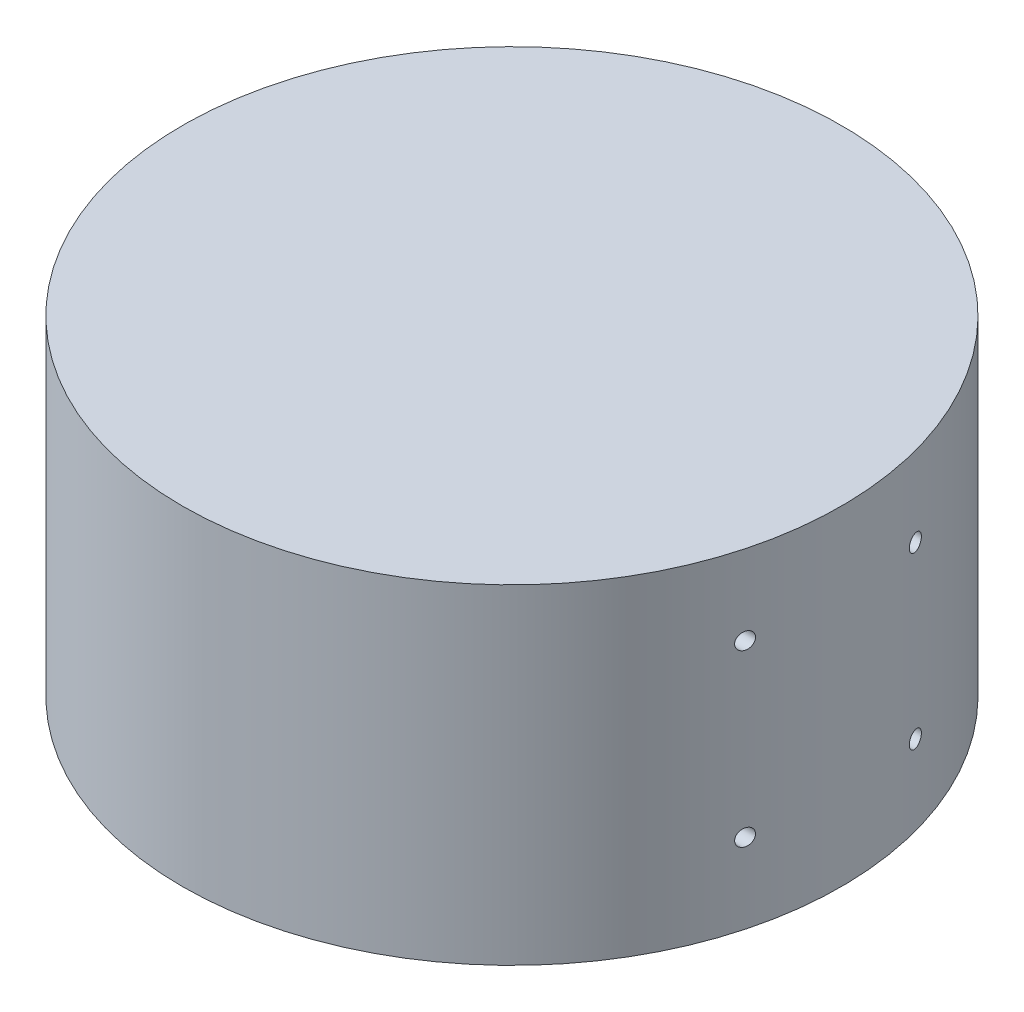
ISO-10303-21;
HEADER;
FILE_DESCRIPTION(('STEP AP214'),'2;1');
FILE_NAME('part.step','',(''),(''),'','','');
FILE_SCHEMA(('AUTOMOTIVE_DESIGN { 1 0 10303 214 1 1 1 1 }'));
ENDSEC;
DATA;
#1=APPLICATION_CONTEXT('core data for automotive mechanical design processes');
#2=APPLICATION_PROTOCOL_DEFINITION('international standard','automotive_design',2000,#1);
#3=PRODUCT_CONTEXT('',#1,'mechanical');
#4=PRODUCT('Part','Part','',(#3));
#5=PRODUCT_RELATED_PRODUCT_CATEGORY('part','',(#4));
#6=PRODUCT_DEFINITION_FORMATION('','',#4);
#7=PRODUCT_DEFINITION_CONTEXT('part definition',#1,'design');
#8=PRODUCT_DEFINITION('design','',#6,#7);
#9=PRODUCT_DEFINITION_SHAPE('','',#8);
#10=(LENGTH_UNIT() NAMED_UNIT(*) SI_UNIT(.MILLI.,.METRE.));
#11=(NAMED_UNIT(*) PLANE_ANGLE_UNIT() SI_UNIT($,.RADIAN.));
#12=(NAMED_UNIT(*) SI_UNIT($,.STERADIAN.) SOLID_ANGLE_UNIT());
#13=UNCERTAINTY_MEASURE_WITH_UNIT(LENGTH_MEASURE(1.E-05),#10,'distance_accuracy_value','');
#14=(GEOMETRIC_REPRESENTATION_CONTEXT(3) GLOBAL_UNCERTAINTY_ASSIGNED_CONTEXT((#13)) GLOBAL_UNIT_ASSIGNED_CONTEXT((#10,
#11,#12)) REPRESENTATION_CONTEXT('',''));
#15=CARTESIAN_POINT('',(0.,0.,0.));
#16=DIRECTION('',(0.,0.,1.));
#17=DIRECTION('',(1.,0.,0.));
#18=AXIS2_PLACEMENT_3D('',#15,#16,#17);
#19=CARTESIAN_POINT('',(0.,60.,0.));
#20=DIRECTION('',(0.,-1.,0.));
#21=DIRECTION('',(0.,0.,-1.));
#22=AXIS2_PLACEMENT_3D('',#19,#20,#21);
#23=CYLINDRICAL_SURFACE('',#22,60.);
#24=CARTESIAN_POINT('',(0.,60.,0.));
#25=DIRECTION('',(0.,1.,0.));
#26=DIRECTION('',(0.,0.,1.));
#27=AXIS2_PLACEMENT_3D('',#24,#25,#26);
#28=CIRCLE('',#27,60.);
#29=CARTESIAN_POINT('',(0.,60.,60.));
#30=VERTEX_POINT('',#29);
#31=EDGE_CURVE('E10',#30,#30,#28,.T.);
#32=ORIENTED_EDGE('',*,*,#31,.F.);
#33=EDGE_LOOP('',(#32));
#34=FACE_BOUND('',#33,.T.);
#35=CARTESIAN_POINT('',(0.,0.,0.));
#36=DIRECTION('',(0.,1.,0.));
#37=DIRECTION('',(0.,0.,1.));
#38=AXIS2_PLACEMENT_3D('',#35,#36,#37);
#39=CIRCLE('',#38,60.);
#40=CARTESIAN_POINT('',(0.,0.,60.));
#41=VERTEX_POINT('',#40);
#42=EDGE_CURVE('E47',#41,#41,#39,.T.);
#43=ORIENTED_EDGE('',*,*,#42,.T.);
#44=EDGE_LOOP('',(#43));
#45=FACE_BOUND('',#44,.T.);
#46=CARTESIAN_POINT('',(57.5412895232632,45.5,17.));
#47=CARTESIAN_POINT('',(57.5412908811892,45.4182326294337,16.9999959494983));
#48=CARTESIAN_POINT('',(57.5432741807796,45.3364037623147,16.9932868323995));
#49=CARTESIAN_POINT('',(57.5511287628096,45.1750494389118,16.9666662172973));
#50=CARTESIAN_POINT('',(57.5570048391719,45.0955269491079,16.9467384405845));
#51=CARTESIAN_POINT('',(57.5723872927471,44.9411987274077,16.8944061522056));
#52=CARTESIAN_POINT('',(57.5818885967046,44.8663865734056,16.8620190759477));
#53=CARTESIAN_POINT('',(57.6041385277815,44.7233707231911,16.7858509202404));
#54=CARTESIAN_POINT('',(57.6168866191756,44.6551659393116,16.742071720485));
#55=CARTESIAN_POINT('',(57.6454208299398,44.5258348726499,16.6435611491899));
#56=CARTESIAN_POINT('',(57.6612591072693,44.4648640748486,16.5886409913848));
#57=CARTESIAN_POINT('',(57.6952556510484,44.3529466508715,16.4700114738405));
#58=CARTESIAN_POINT('',(57.7134143825888,44.3020020394677,16.4063003519151));
#59=CARTESIAN_POINT('',(57.7521956008776,44.2095300582805,16.2692703024575));
#60=CARTESIAN_POINT('',(57.7728857613248,44.1684374631402,16.1956770790481));
#61=CARTESIAN_POINT('',(57.8154806617054,44.099203695743,16.0429573159664));
#62=CARTESIAN_POINT('',(57.8373856223773,44.0710648859868,15.9638297699779));
#63=CARTESIAN_POINT('',(57.8824838847951,44.0276819175861,15.7995423428161));
#64=CARTESIAN_POINT('',(57.9056959693134,44.0128809060348,15.7142703423417));
#65=CARTESIAN_POINT('',(57.9520561727233,43.9981217158733,15.5424292370229));
#66=CARTESIAN_POINT('',(57.9752042853026,43.9981649531156,15.4558600092357));
#67=CARTESIAN_POINT('',(58.0210689714669,44.0132405422657,15.2827897926308));
#68=CARTESIAN_POINT('',(58.0437770354963,44.0284527233011,15.1963020837788));
#69=CARTESIAN_POINT('',(58.0878436076076,44.073840099315,15.0269784596456));
#70=CARTESIAN_POINT('',(58.1092021569615,44.1040148364458,14.944142432709));
#71=CARTESIAN_POINT('',(58.1497560946787,44.1782065987721,14.785550249001));
#72=CARTESIAN_POINT('',(58.1689733540144,44.2220620157058,14.7097241882898));
#73=CARTESIAN_POINT('',(58.2050078711796,44.3226275512618,14.5664861846479));
#74=CARTESIAN_POINT('',(58.2218254709418,44.3793358354652,14.4990730431144));
#75=CARTESIAN_POINT('',(58.2521928261732,44.5023782072571,14.3765752455179));
#76=CARTESIAN_POINT('',(58.2658186057921,44.5684107760745,14.321206671657));
#77=CARTESIAN_POINT('',(58.2900185318361,44.709359375644,14.2223885671139));
#78=CARTESIAN_POINT('',(58.3005932154826,44.7842738392357,14.1789369382232));
#79=CARTESIAN_POINT('',(58.3181505438533,44.9384598137236,14.106547056615));
#80=CARTESIAN_POINT('',(58.3252304178035,45.0175362147264,14.0772165941782));
#81=CARTESIAN_POINT('',(58.3360809178964,45.1796943629389,14.0321846347555));
#82=CARTESIAN_POINT('',(58.33985199445,45.2627755633694,14.016481282779));
#83=CARTESIAN_POINT('',(58.3439477185443,45.4287201263662,13.9994228532657));
#84=CARTESIAN_POINT('',(58.3443427325838,45.5115517674949,13.9977748253811));
#85=CARTESIAN_POINT('',(58.3418615112146,45.6763067469129,14.0081127554413));
#86=CARTESIAN_POINT('',(58.3389854621356,45.7582301366707,14.0200979367961));
#87=CARTESIAN_POINT('',(58.33005802858,45.9183602265391,14.0571934395106));
#88=CARTESIAN_POINT('',(58.3240251582338,45.9965857279218,14.0822272300787));
#89=CARTESIAN_POINT('',(58.3089386332873,46.1476670853896,14.1445642492227));
#90=CARTESIAN_POINT('',(58.2998848924764,46.2205227881573,14.1818678279572));
#91=CARTESIAN_POINT('',(58.2788594081178,46.3596518644743,14.2680245681207));
#92=CARTESIAN_POINT('',(58.2668581497157,46.4258484657164,14.3169943901587));
#93=CARTESIAN_POINT('',(58.240271774953,46.5490806315046,14.4247640236978));
#94=CARTESIAN_POINT('',(58.2256863976043,46.6061152696106,14.4835648280638));
#95=CARTESIAN_POINT('',(58.1939010802357,46.7108655869578,14.6107585598186));
#96=CARTESIAN_POINT('',(58.1766476898185,46.7583303815561,14.6793446521752));
#97=CARTESIAN_POINT('',(58.1402056934638,46.8411105945857,14.8230216768645));
#98=CARTESIAN_POINT('',(58.1210168096293,46.8764242651455,14.8981135430732));
#99=CARTESIAN_POINT('',(58.0805749714289,46.9349938315067,15.0550177227406));
#100=CARTESIAN_POINT('',(58.0592778211058,46.9578632153123,15.1369629529884));
#101=CARTESIAN_POINT('',(58.0156632637431,46.9894518030429,15.3032744335607));
#102=CARTESIAN_POINT('',(57.993345703613,46.9981688765087,15.38764104645));
#103=CARTESIAN_POINT('',(57.9477090389896,47.0013507185921,15.5586322300722));
#104=CARTESIAN_POINT('',(57.9243788340493,46.9954550804134,15.6452606999615));
#105=CARTESIAN_POINT('',(57.877918708603,46.9688306439037,15.8162695209915));
#106=CARTESIAN_POINT('',(57.8547888064193,46.9481005028238,15.9006496679073));
#107=CARTESIAN_POINT('',(57.8092319627405,46.8920699454587,16.0654933600222));
#108=CARTESIAN_POINT('',(57.7868126521254,46.8566473796735,16.1459175929277));
#109=CARTESIAN_POINT('',(57.7436266351698,46.7720808645586,16.2996922501048));
#110=CARTESIAN_POINT('',(57.7228597941949,46.7229380345567,16.3730432507691));
#111=CARTESIAN_POINT('',(57.6840354968212,46.6130380973665,16.5093003432263));
#112=CARTESIAN_POINT('',(57.6659406992539,46.5524749531127,16.5723520337017));
#113=CARTESIAN_POINT('',(57.6327768224774,46.4208180867008,16.6873193093194));
#114=CARTESIAN_POINT('',(57.6177079150619,46.3497237670374,16.7392342621893));
#115=CARTESIAN_POINT('',(57.5917057128742,46.2016901728298,16.8284736377231));
#116=CARTESIAN_POINT('',(57.5806463241498,46.1250418845278,16.8662444464706));
#117=CARTESIAN_POINT('',(57.562437924584,45.9661093796829,16.9282839531629));
#118=CARTESIAN_POINT('',(57.5552828325515,45.8838341537185,16.9525736498165));
#119=CARTESIAN_POINT('',(57.5472689386444,45.7507530584909,16.9797508172774));
#120=CARTESIAN_POINT('',(57.5450306861752,45.7009396826709,16.9873326734463));
#121=CARTESIAN_POINT('',(57.5420405753519,45.6007586489173,16.9974584610788));
#122=CARTESIAN_POINT('',(57.5412886864104,45.5503910024112,17.0000024962138));
#123=CARTESIAN_POINT('',(57.5412895232632,45.5,17.));
#124=B_SPLINE_CURVE_WITH_KNOTS('',3,(#46,#47,#48,#49,#50,#51,#52,#53,#54,#55,#56,#57,#58,#59,
#60,#61,#62,#63,#64,#65,#66,#67,#68,#69,#70,#71,#72,#73,#74,#75,#76,#77,#78,#79,#80,#81,#82,#83,
#84,#85,#86,#87,#88,#89,#90,#91,#92,#93,#94,#95,#96,#97,#98,#99,#100,#101,#102,#103,#104,#105,
#106,#107,#108,#109,#110,#111,#112,#113,#114,#115,#116,#117,#118,#119,#120,#121,#122,#123),
.UNSPECIFIED.,.T.,.F.,(4,2,2,2,2,2,2,2,2,2,2,2,2,2,2,2,2,2,2,2,2,2,2,2,2,2,2,2,2,2,2,2,2,2,2,2,
2,2,4),(0.,0.24511370838719,0.490529834811903,0.735603770568287,0.980637294875964,
1.23023427047646,1.47988135173535,1.73907799635843,1.99832189434247,2.26589165270358,
2.53348693202182,2.80429274726367,3.07509027647466,3.34280286328429,3.61047726498333,
3.87091851466367,4.13131387914746,4.38398661397522,4.63662494832549,4.88398441846463,
5.13132979894572,5.37724054269092,5.62315830491376,5.87164684654617,6.1201604990691,
6.3745223339794,6.62892074213777,6.89082526907797,7.1527692189258,7.42123770864796,
7.68973050194321,7.96050170558759,8.2312508255996,8.49775936019271,8.76428302142561,
9.02149505292747,9.27830530834744,9.4293653163921,9.58042221579836),.UNSPECIFIED.);
#125=CARTESIAN_POINT('',(57.5412895232632,45.5,17.));
#126=VERTEX_POINT('',#125);
#127=EDGE_CURVE('E58',#126,#126,#124,.T.);
#128=ORIENTED_EDGE('',*,*,#127,.F.);
#129=EDGE_LOOP('',(#128));
#130=FACE_BOUND('',#129,.T.);
#131=CARTESIAN_POINT('',(57.5412895232632,14.5,17.));
#132=CARTESIAN_POINT('',(57.5412908811892,14.4182326294337,16.9999959494983));
#133=CARTESIAN_POINT('',(57.5432741807796,14.3364037623147,16.9932868323995));
#134=CARTESIAN_POINT('',(57.5511287628096,14.1750494389118,16.9666662172973));
#135=CARTESIAN_POINT('',(57.5570048391719,14.0955269491079,16.9467384405845));
#136=CARTESIAN_POINT('',(57.5723872927471,13.9411987274077,16.8944061522056));
#137=CARTESIAN_POINT('',(57.5818885967046,13.8663865734057,16.8620190759477));
#138=CARTESIAN_POINT('',(57.6041385277815,13.7233707231911,16.7858509202404));
#139=CARTESIAN_POINT('',(57.6168866191756,13.6551659393116,16.742071720485));
#140=CARTESIAN_POINT('',(57.6454208299398,13.5258348726499,16.6435611491899));
#141=CARTESIAN_POINT('',(57.6612591072693,13.4648640748486,16.5886409913848));
#142=CARTESIAN_POINT('',(57.6952556510484,13.3529466508715,16.4700114738405));
#143=CARTESIAN_POINT('',(57.7134143825888,13.3020020394677,16.4063003519151));
#144=CARTESIAN_POINT('',(57.7521956008776,13.2095300582806,16.2692703024575));
#145=CARTESIAN_POINT('',(57.7728857613248,13.1684374631402,16.1956770790481));
#146=CARTESIAN_POINT('',(57.8154806617054,13.099203695743,16.0429573159664));
#147=CARTESIAN_POINT('',(57.8373856223773,13.0710648859868,15.9638297699779));
#148=CARTESIAN_POINT('',(57.8824838847951,13.0276819175861,15.7995423428161));
#149=CARTESIAN_POINT('',(57.9056959693134,13.0128809060348,15.7142703423417));
#150=CARTESIAN_POINT('',(57.9520561727233,12.9981217158733,15.5424292370229));
#151=CARTESIAN_POINT('',(57.9752042853026,12.9981649531156,15.4558600092357));
#152=CARTESIAN_POINT('',(58.0210689714669,13.0132405422657,15.2827897926308));
#153=CARTESIAN_POINT('',(58.0437770354963,13.0284527233011,15.1963020837788));
#154=CARTESIAN_POINT('',(58.0878436076076,13.073840099315,15.0269784596456));
#155=CARTESIAN_POINT('',(58.1092021569615,13.1040148364458,14.944142432709));
#156=CARTESIAN_POINT('',(58.1497560946787,13.1782065987721,14.785550249001));
#157=CARTESIAN_POINT('',(58.1689733540144,13.2220620157058,14.7097241882898));
#158=CARTESIAN_POINT('',(58.2050078711796,13.3226275512618,14.5664861846479));
#159=CARTESIAN_POINT('',(58.2218254709418,13.3793358354652,14.4990730431144));
#160=CARTESIAN_POINT('',(58.2521928261732,13.5023782072571,14.3765752455179));
#161=CARTESIAN_POINT('',(58.2658186057921,13.5684107760745,14.321206671657));
#162=CARTESIAN_POINT('',(58.2900185318361,13.709359375644,14.2223885671139));
#163=CARTESIAN_POINT('',(58.3005932154826,13.7842738392357,14.1789369382232));
#164=CARTESIAN_POINT('',(58.3181505438533,13.9384598137236,14.106547056615));
#165=CARTESIAN_POINT('',(58.3252304178035,14.0175362147264,14.0772165941782));
#166=CARTESIAN_POINT('',(58.3360809178964,14.1796943629389,14.0321846347555));
#167=CARTESIAN_POINT('',(58.33985199445,14.2627755633695,14.016481282779));
#168=CARTESIAN_POINT('',(58.3439477185443,14.4287201263662,13.9994228532657));
#169=CARTESIAN_POINT('',(58.3443427325838,14.5115517674949,13.9977748253811));
#170=CARTESIAN_POINT('',(58.3418615112146,14.6763067469129,14.0081127554413));
#171=CARTESIAN_POINT('',(58.3389854621356,14.7582301366707,14.0200979367961));
#172=CARTESIAN_POINT('',(58.33005802858,14.9183602265391,14.0571934395106));
#173=CARTESIAN_POINT('',(58.3240251582338,14.9965857279218,14.0822272300787));
#174=CARTESIAN_POINT('',(58.3089386332873,15.1476670853896,14.1445642492227));
#175=CARTESIAN_POINT('',(58.2998848924764,15.2205227881573,14.1818678279572));
#176=CARTESIAN_POINT('',(58.2788594081178,15.3596518644743,14.2680245681207));
#177=CARTESIAN_POINT('',(58.2668581497157,15.4258484657164,14.3169943901587));
#178=CARTESIAN_POINT('',(58.240271774953,15.5490806315046,14.4247640236978));
#179=CARTESIAN_POINT('',(58.2256863976043,15.6061152696106,14.4835648280638));
#180=CARTESIAN_POINT('',(58.1939010802357,15.7108655869578,14.6107585598186));
#181=CARTESIAN_POINT('',(58.1766476898185,15.7583303815561,14.6793446521752));
#182=CARTESIAN_POINT('',(58.1402056934638,15.8411105945857,14.8230216768645));
#183=CARTESIAN_POINT('',(58.1210168096293,15.8764242651455,14.8981135430732));
#184=CARTESIAN_POINT('',(58.0805749714289,15.9349938315068,15.0550177227406));
#185=CARTESIAN_POINT('',(58.0592778211058,15.9578632153123,15.1369629529884));
#186=CARTESIAN_POINT('',(58.0156632637431,15.9894518030429,15.3032744335607));
#187=CARTESIAN_POINT('',(57.993345703613,15.9981688765087,15.38764104645));
#188=CARTESIAN_POINT('',(57.9477090389896,16.0013507185921,15.5586322300722));
#189=CARTESIAN_POINT('',(57.9243788340493,15.9954550804134,15.6452606999615));
#190=CARTESIAN_POINT('',(57.877918708603,15.9688306439037,15.8162695209915));
#191=CARTESIAN_POINT('',(57.8547888064193,15.9481005028238,15.9006496679073));
#192=CARTESIAN_POINT('',(57.8092319627405,15.8920699454587,16.0654933600222));
#193=CARTESIAN_POINT('',(57.7868126521254,15.8566473796735,16.1459175929277));
#194=CARTESIAN_POINT('',(57.7436266351698,15.7720808645586,16.2996922501048));
#195=CARTESIAN_POINT('',(57.7228597941949,15.7229380345567,16.3730432507691));
#196=CARTESIAN_POINT('',(57.6840354968212,15.6130380973665,16.5093003432263));
#197=CARTESIAN_POINT('',(57.6659406992539,15.5524749531127,16.5723520337017));
#198=CARTESIAN_POINT('',(57.6327768224774,15.4208180867008,16.6873193093194));
#199=CARTESIAN_POINT('',(57.6177079150619,15.3497237670374,16.7392342621893));
#200=CARTESIAN_POINT('',(57.5917057128742,15.2016901728298,16.8284736377232));
#201=CARTESIAN_POINT('',(57.5806463241498,15.1250418845278,16.8662444464706));
#202=CARTESIAN_POINT('',(57.562437924584,14.9661093796829,16.9282839531629));
#203=CARTESIAN_POINT('',(57.5552828325515,14.8838341537184,16.9525736498165));
#204=CARTESIAN_POINT('',(57.5472689386444,14.7507530584909,16.9797508172774));
#205=CARTESIAN_POINT('',(57.5450306861752,14.7009396826709,16.9873326734462));
#206=CARTESIAN_POINT('',(57.5420405753519,14.6007586489173,16.9974584610788));
#207=CARTESIAN_POINT('',(57.5412886864104,14.5503910024112,17.0000024962138));
#208=CARTESIAN_POINT('',(57.5412895232632,14.5,17.));
#209=B_SPLINE_CURVE_WITH_KNOTS('',3,(#131,#132,#133,#134,#135,#136,#137,#138,#139,#140,#141,
#142,#143,#144,#145,#146,#147,#148,#149,#150,#151,#152,#153,#154,#155,#156,#157,#158,#159,#160,
#161,#162,#163,#164,#165,#166,#167,#168,#169,#170,#171,#172,#173,#174,#175,#176,#177,#178,#179,
#180,#181,#182,#183,#184,#185,#186,#187,#188,#189,#190,#191,#192,#193,#194,#195,#196,#197,#198,
#199,#200,#201,#202,#203,#204,#205,#206,#207,#208),.UNSPECIFIED.,.T.,.F.,(4,2,2,2,2,2,2,2,2,2,2,
2,2,2,2,2,2,2,2,2,2,2,2,2,2,2,2,2,2,2,2,2,2,2,2,2,2,2,4),(0.,0.245113708387185,
0.490529834811903,0.735603770568278,0.980637294875967,1.23023427047646,1.47988135173536,
1.73907799635843,1.99832189434247,2.26589165270358,2.53348693202181,2.80429274726367,
3.07509027647465,3.34280286328429,3.61047726498332,3.87091851466367,4.13131387914746,
4.38398661397522,4.63662494832549,4.88398441846463,5.13132979894572,5.37724054269092,
5.62315830491377,5.87164684654617,6.12016049906909,6.3745223339794,6.62892074213777,
6.89082526907796,7.1527692189258,7.42123770864796,7.68973050194321,7.96050170558759,
8.23125082559959,8.4977593601927,8.76428302142561,9.02149505292747,9.27830530834744,
9.4293653163921,9.58042221579836),.UNSPECIFIED.);
#210=CARTESIAN_POINT('',(57.5412895232632,14.5,17.));
#211=VERTEX_POINT('',#210);
#212=EDGE_CURVE('E69',#211,#211,#209,.T.);
#213=ORIENTED_EDGE('',*,*,#212,.F.);
#214=EDGE_LOOP('',(#213));
#215=FACE_BOUND('',#214,.T.);
#216=CARTESIAN_POINT('',(58.3438085832593,14.5,-14.));
#217=CARTESIAN_POINT('',(58.3438078001761,14.4175186238046,-14.0000039311299));
#218=CARTESIAN_POINT('',(58.3421711712605,14.3349759300045,-14.0068292327787));
#219=CARTESIAN_POINT('',(58.3356584505329,14.1721922684869,-14.0339281537845));
#220=CARTESIAN_POINT('',(58.3307784039203,14.0919542356712,-14.0542181910683));
#221=CARTESIAN_POINT('',(58.3179003178193,13.9361933387147,-14.1075600283993));
#222=CARTESIAN_POINT('',(58.3099054425339,13.8606657794727,-14.1405988772233));
#223=CARTESIAN_POINT('',(58.2909905213367,13.7163270339632,-14.2183690240786));
#224=CARTESIAN_POINT('',(58.2800710882487,13.64751444473,-14.2630978724916));
#225=CARTESIAN_POINT('',(58.25542500037,13.5176462361712,-14.3634309343529));
#226=CARTESIAN_POINT('',(58.2416681724619,13.4566864969171,-14.4191517339661));
#227=CARTESIAN_POINT('',(58.2117504817212,13.3449640525815,-14.5394615573852));
#228=CARTESIAN_POINT('',(58.1955892653354,13.2942028497276,-14.6040518853023));
#229=CARTESIAN_POINT('',(58.1607869719543,13.2028735532886,-14.7420502732379));
#230=CARTESIAN_POINT('',(58.1420916913198,13.1626099287216,-14.8156461013188));
#231=CARTESIAN_POINT('',(58.1030237251492,13.094983792174,-14.9681270278896));
#232=CARTESIAN_POINT('',(58.0826507855529,13.0676232384363,-15.0470129271569));
#233=CARTESIAN_POINT('',(58.0401098484885,13.025762051051,-15.2102914513988));
#234=CARTESIAN_POINT('',(58.0179067301376,13.0116620787239,-15.2947777236628));
#235=CARTESIAN_POINT('',(57.9728334353557,12.9979917290548,-15.464744311989));
#236=CARTESIAN_POINT('',(57.9499631692333,12.9984233144163,-15.5502247607709));
#237=CARTESIAN_POINT('',(57.9036945742502,13.0139206419453,-15.7216474368604));
#238=CARTESIAN_POINT('',(57.8802952126798,13.0292925214034,-15.8075618760755));
#239=CARTESIAN_POINT('',(57.8341400711712,13.0747352230174,-15.9756013859476));
#240=CARTESIAN_POINT('',(57.8113843281627,13.1048068868206,-16.0577262393343));
#241=CARTESIAN_POINT('',(57.7672121300057,13.1789764075843,-16.2159168891452));
#242=CARTESIAN_POINT('',(57.7457974152316,13.2230920570265,-16.2919748456533));
#243=CARTESIAN_POINT('',(57.7050849130001,13.3242551934104,-16.4355941082723));
#244=CARTESIAN_POINT('',(57.6857869166224,13.3813014023981,-16.5031562530167));
#245=CARTESIAN_POINT('',(57.6504583148954,13.5053873583415,-16.6261440356005));
#246=CARTESIAN_POINT('',(57.634362766846,13.5721670693402,-16.6818130778326));
#247=CARTESIAN_POINT('',(57.6055497741888,13.7148375593879,-16.7810403202411));
#248=CARTESIAN_POINT('',(57.592831522258,13.7907261547016,-16.8246014148687));
#249=CARTESIAN_POINT('',(57.5717473291292,13.9463227666642,-16.8966052594247));
#250=CARTESIAN_POINT('',(57.5632326111865,14.0257710651598,-16.9255657218387));
#251=CARTESIAN_POINT('',(57.5502173283025,14.1887080414259,-16.9697679252562));
#252=CARTESIAN_POINT('',(57.545715846504,14.2721957917527,-16.9850127997069));
#253=CARTESIAN_POINT('',(57.5410121371551,14.4378231357527,-17.0009408009628));
#254=CARTESIAN_POINT('',(57.5406704352548,14.5199136649671,-17.0020963350841));
#255=CARTESIAN_POINT('',(57.5439401629321,14.6831020850396,-16.991026550047));
#256=CARTESIAN_POINT('',(57.5475512495556,14.7642000613967,-16.9788023917451));
#257=CARTESIAN_POINT('',(57.5585153215224,14.9222930890066,-16.9415961713903));
#258=CARTESIAN_POINT('',(57.5658311351036,14.9993206618871,-16.9167408369704));
#259=CARTESIAN_POINT('',(57.5838860021899,15.1480477905019,-16.8551800916754));
#260=CARTESIAN_POINT('',(57.5946252811858,15.2197469948925,-16.8184739002265));
#261=CARTESIAN_POINT('',(57.6193441020018,15.3572602076458,-16.7335939846834));
#262=CARTESIAN_POINT('',(57.6333800142376,15.4229404971507,-16.6852203145159));
#263=CARTESIAN_POINT('',(57.6640641602434,15.5452866311018,-16.5788649251896));
#264=CARTESIAN_POINT('',(57.6807128266238,15.6019509795866,-16.5208816148122));
#265=CARTESIAN_POINT('',(57.7167080150246,15.706851697106,-16.3946962764043));
#266=CARTESIAN_POINT('',(57.7361304788955,15.7547079065891,-16.3261999249023));
#267=CARTESIAN_POINT('',(57.7765480703366,15.8382765104049,-16.1825849552189));
#268=CARTESIAN_POINT('',(57.797543491954,15.8739866272114,-16.1074650983788));
#269=CARTESIAN_POINT('',(57.8412478774046,15.9335288830084,-15.9498264010299));
#270=CARTESIAN_POINT('',(57.863991279033,15.9568899159785,-15.8671389385609));
#271=CARTESIAN_POINT('',(57.9098133965077,15.9891916512517,-15.6990795703148));
#272=CARTESIAN_POINT('',(57.9328921564369,15.9981304401199,-15.6137073098705));
#273=CARTESIAN_POINT('',(57.9791745985821,16.0013717401006,-15.440966786954));
#274=CARTESIAN_POINT('',(58.0023723085028,15.9953926487216,-15.3535914437224));
#275=CARTESIAN_POINT('',(58.0477949502435,15.9682799571063,-15.180957500338));
#276=CARTESIAN_POINT('',(58.0700198723862,15.9471462061475,-15.0956989212466));
#277=CARTESIAN_POINT('',(58.1127902364789,15.890304799711,-14.9302004877642));
#278=CARTESIAN_POINT('',(58.133343016017,15.8546654557453,-14.8499391152367));
#279=CARTESIAN_POINT('',(58.1723289007088,15.7696616291503,-14.6964765726495));
#280=CARTESIAN_POINT('',(58.190762331457,15.7202992587771,-14.62327431838));
#281=CARTESIAN_POINT('',(58.2246073232561,15.6104564791125,-14.4879213014619));
#282=CARTESIAN_POINT('',(58.2400800742986,15.5502668274911,-14.4255499982009));
#283=CARTESIAN_POINT('',(58.2681315299419,15.4196369209254,-14.3118233818537));
#284=CARTESIAN_POINT('',(58.2807099874931,15.3491957917781,-14.2604690091703));
#285=CARTESIAN_POINT('',(58.3023091057301,15.2023461087536,-14.1719009330789));
#286=CARTESIAN_POINT('',(58.3114244772943,15.1261774274637,-14.1343119999724));
#287=CARTESIAN_POINT('',(58.3263750861232,14.9683765201506,-14.0724906025068));
#288=CARTESIAN_POINT('',(58.3322149934561,14.8867522594643,-14.0482391229336));
#289=CARTESIAN_POINT('',(58.3388283318215,14.7537701659274,-14.0207421950003));
#290=CARTESIAN_POINT('',(58.3406938617665,14.7033562364366,-14.0129750038484));
#291=CARTESIAN_POINT('',(58.343184221256,14.6019693462028,-14.0026027256617));
#292=CARTESIAN_POINT('',(58.3438090674221,14.5509963929582,-13.9999975694701));
#293=CARTESIAN_POINT('',(58.3438085832593,14.5,-14.));
#294=B_SPLINE_CURVE_WITH_KNOTS('',3,(#216,#217,#218,#219,#220,#221,#222,#223,#224,#225,#226,
#227,#228,#229,#230,#231,#232,#233,#234,#235,#236,#237,#238,#239,#240,#241,#242,#243,#244,#245,
#246,#247,#248,#249,#250,#251,#252,#253,#254,#255,#256,#257,#258,#259,#260,#261,#262,#263,#264,
#265,#266,#267,#268,#269,#270,#271,#272,#273,#274,#275,#276,#277,#278,#279,#280,#281,#282,#283,
#284,#285,#286,#287,#288,#289,#290,#291,#292,#293),.UNSPECIFIED.,.T.,.F.,(4,2,2,2,2,2,2,2,2,2,2,
2,2,2,2,2,2,2,2,2,2,2,2,2,2,2,2,2,2,2,2,2,2,2,2,2,2,2,4),(0.,0.247255327668205,
0.494812695951218,0.742119235705913,0.989373994316478,1.23940784624599,1.48947850079056,
1.74615087308609,2.00286218690347,2.26710183156632,2.53137716587533,2.80118438776369,
3.07100705948077,3.34117294214662,3.61131213539224,3.87523797434824,4.13910066645397,
4.39279960585523,4.64644057076525,4.89155276405746,5.13664369247454,5.37932280833655,
5.62201791186998,5.86921150432418,6.11644606946247,6.37264653194077,6.62889500837774,
6.89431907794376,7.1597783590825,7.43028644157441,7.70079721447414,7.97004853925143,
8.23925844363695,8.5020974003744,8.76495878406749,9.02000012181709,9.27467689811153,
9.42755139369658,9.58042384117993),.UNSPECIFIED.);
#295=CARTESIAN_POINT('',(58.3438085832593,14.5,-14.));
#296=VERTEX_POINT('',#295);
#297=EDGE_CURVE('E114',#296,#296,#294,.T.);
#298=ORIENTED_EDGE('',*,*,#297,.F.);
#299=EDGE_LOOP('',(#298));
#300=FACE_BOUND('',#299,.T.);
#301=CARTESIAN_POINT('',(58.3438085832593,45.5,-14.));
#302=CARTESIAN_POINT('',(58.3438078001761,45.4175186238046,-14.0000039311299));
#303=CARTESIAN_POINT('',(58.3421711712605,45.3349759300045,-14.0068292327787));
#304=CARTESIAN_POINT('',(58.3356584505329,45.1721922684869,-14.0339281537845));
#305=CARTESIAN_POINT('',(58.3307784039203,45.0919542356712,-14.0542181910683));
#306=CARTESIAN_POINT('',(58.3179003178193,44.9361933387147,-14.1075600283993));
#307=CARTESIAN_POINT('',(58.3099054425339,44.8606657794727,-14.1405988772233));
#308=CARTESIAN_POINT('',(58.2909905213367,44.7163270339632,-14.2183690240786));
#309=CARTESIAN_POINT('',(58.2800710882487,44.64751444473,-14.2630978724916));
#310=CARTESIAN_POINT('',(58.25542500037,44.5176462361712,-14.3634309343529));
#311=CARTESIAN_POINT('',(58.2416681724619,44.4566864969171,-14.4191517339661));
#312=CARTESIAN_POINT('',(58.2117504817212,44.3449640525815,-14.5394615573852));
#313=CARTESIAN_POINT('',(58.1955892653354,44.2942028497276,-14.6040518853023));
#314=CARTESIAN_POINT('',(58.1607869719543,44.2028735532886,-14.7420502732379));
#315=CARTESIAN_POINT('',(58.1420916913198,44.1626099287216,-14.8156461013188));
#316=CARTESIAN_POINT('',(58.1030237251492,44.094983792174,-14.9681270278896));
#317=CARTESIAN_POINT('',(58.0826507855528,44.0676232384363,-15.0470129271569));
#318=CARTESIAN_POINT('',(58.0401098484885,44.025762051051,-15.2102914513988));
#319=CARTESIAN_POINT('',(58.0179067301376,44.0116620787239,-15.2947777236628));
#320=CARTESIAN_POINT('',(57.9728334353557,43.9979917290548,-15.464744311989));
#321=CARTESIAN_POINT('',(57.9499631692333,43.9984233144163,-15.5502247607709));
#322=CARTESIAN_POINT('',(57.9036945742502,44.0139206419453,-15.7216474368604));
#323=CARTESIAN_POINT('',(57.8802952126798,44.0292925214034,-15.8075618760755));
#324=CARTESIAN_POINT('',(57.8341400711712,44.0747352230173,-15.9756013859476));
#325=CARTESIAN_POINT('',(57.8113843281627,44.1048068868206,-16.0577262393343));
#326=CARTESIAN_POINT('',(57.7672121300057,44.1789764075843,-16.2159168891452));
#327=CARTESIAN_POINT('',(57.7457974152316,44.2230920570265,-16.2919748456533));
#328=CARTESIAN_POINT('',(57.7050849130001,44.3242551934104,-16.4355941082723));
#329=CARTESIAN_POINT('',(57.6857869166224,44.3813014023981,-16.5031562530167));
#330=CARTESIAN_POINT('',(57.6504583148954,44.5053873583415,-16.6261440356005));
#331=CARTESIAN_POINT('',(57.634362766846,44.5721670693402,-16.6818130778326));
#332=CARTESIAN_POINT('',(57.6055497741888,44.7148375593879,-16.7810403202412));
#333=CARTESIAN_POINT('',(57.592831522258,44.7907261547016,-16.8246014148687));
#334=CARTESIAN_POINT('',(57.5717473291292,44.9463227666642,-16.8966052594247));
#335=CARTESIAN_POINT('',(57.5632326111865,45.0257710651598,-16.9255657218387));
#336=CARTESIAN_POINT('',(57.5502173283025,45.1887080414259,-16.9697679252562));
#337=CARTESIAN_POINT('',(57.545715846504,45.2721957917527,-16.9850127997069));
#338=CARTESIAN_POINT('',(57.5410121371551,45.4378231357527,-17.0009408009628));
#339=CARTESIAN_POINT('',(57.5406704352548,45.5199136649671,-17.0020963350841));
#340=CARTESIAN_POINT('',(57.5439401629321,45.6831020850396,-16.991026550047));
#341=CARTESIAN_POINT('',(57.5475512495556,45.7642000613967,-16.9788023917451));
#342=CARTESIAN_POINT('',(57.5585153215224,45.9222930890066,-16.9415961713903));
#343=CARTESIAN_POINT('',(57.5658311351036,45.9993206618871,-16.9167408369704));
#344=CARTESIAN_POINT('',(57.5838860021899,46.1480477905019,-16.8551800916754));
#345=CARTESIAN_POINT('',(57.5946252811858,46.2197469948925,-16.8184739002265));
#346=CARTESIAN_POINT('',(57.6193441020018,46.3572602076458,-16.7335939846834));
#347=CARTESIAN_POINT('',(57.6333800142376,46.4229404971507,-16.6852203145159));
#348=CARTESIAN_POINT('',(57.6640641602434,46.5452866311018,-16.5788649251896));
#349=CARTESIAN_POINT('',(57.6807128266238,46.6019509795866,-16.5208816148122));
#350=CARTESIAN_POINT('',(57.7167080150246,46.706851697106,-16.3946962764043));
#351=CARTESIAN_POINT('',(57.7361304788955,46.7547079065891,-16.3261999249023));
#352=CARTESIAN_POINT('',(57.7765480703366,46.8382765104049,-16.1825849552189));
#353=CARTESIAN_POINT('',(57.797543491954,46.8739866272114,-16.1074650983788));
#354=CARTESIAN_POINT('',(57.8412478774046,46.9335288830084,-15.9498264010299));
#355=CARTESIAN_POINT('',(57.863991279033,46.9568899159785,-15.8671389385609));
#356=CARTESIAN_POINT('',(57.9098133965077,46.9891916512517,-15.6990795703148));
#357=CARTESIAN_POINT('',(57.9328921564369,46.9981304401199,-15.6137073098705));
#358=CARTESIAN_POINT('',(57.9791745985821,47.0013717401006,-15.440966786954));
#359=CARTESIAN_POINT('',(58.0023723085028,46.9953926487216,-15.3535914437224));
#360=CARTESIAN_POINT('',(58.0477949502435,46.9682799571063,-15.180957500338));
#361=CARTESIAN_POINT('',(58.0700198723862,46.9471462061475,-15.0956989212466));
#362=CARTESIAN_POINT('',(58.1127902364789,46.890304799711,-14.9302004877642));
#363=CARTESIAN_POINT('',(58.133343016017,46.8546654557452,-14.8499391152367));
#364=CARTESIAN_POINT('',(58.1723289007088,46.7696616291503,-14.6964765726495));
#365=CARTESIAN_POINT('',(58.190762331457,46.7202992587771,-14.62327431838));
#366=CARTESIAN_POINT('',(58.2246073232561,46.6104564791125,-14.4879213014619));
#367=CARTESIAN_POINT('',(58.2400800742986,46.5502668274911,-14.4255499982009));
#368=CARTESIAN_POINT('',(58.2681315299419,46.4196369209254,-14.3118233818537));
#369=CARTESIAN_POINT('',(58.2807099874931,46.3491957917781,-14.2604690091703));
#370=CARTESIAN_POINT('',(58.3023091057301,46.2023461087535,-14.1719009330789));
#371=CARTESIAN_POINT('',(58.3114244772943,46.1261774274637,-14.1343119999724));
#372=CARTESIAN_POINT('',(58.3263750861232,45.9683765201506,-14.0724906025068));
#373=CARTESIAN_POINT('',(58.3322149934561,45.8867522594643,-14.0482391229336));
#374=CARTESIAN_POINT('',(58.3388283318215,45.7537701659274,-14.0207421950003));
#375=CARTESIAN_POINT('',(58.3406938617665,45.7033562364366,-14.0129750038484));
#376=CARTESIAN_POINT('',(58.343184221256,45.6019693462028,-14.0026027256617));
#377=CARTESIAN_POINT('',(58.3438090674221,45.5509963929582,-13.9999975694701));
#378=CARTESIAN_POINT('',(58.3438085832593,45.5,-14.));
#379=B_SPLINE_CURVE_WITH_KNOTS('',3,(#301,#302,#303,#304,#305,#306,#307,#308,#309,#310,#311,
#312,#313,#314,#315,#316,#317,#318,#319,#320,#321,#322,#323,#324,#325,#326,#327,#328,#329,#330,
#331,#332,#333,#334,#335,#336,#337,#338,#339,#340,#341,#342,#343,#344,#345,#346,#347,#348,#349,
#350,#351,#352,#353,#354,#355,#356,#357,#358,#359,#360,#361,#362,#363,#364,#365,#366,#367,#368,
#369,#370,#371,#372,#373,#374,#375,#376,#377,#378),.UNSPECIFIED.,.T.,.F.,(4,2,2,2,2,2,2,2,2,2,2,
2,2,2,2,2,2,2,2,2,2,2,2,2,2,2,2,2,2,2,2,2,2,2,2,2,2,2,4),(0.,0.247255327668205,
0.494812695951214,0.74211923570591,0.989373994316477,1.23940784624599,1.48947850079056,
1.74615087308608,2.00286218690347,2.26710183156632,2.53137716587533,2.80118438776369,
3.07100705948077,3.34117294214662,3.61131213539223,3.87523797434824,4.13910066645397,
4.39279960585523,4.64644057076524,4.89155276405745,5.13664369247454,5.37932280833655,
5.62201791186997,5.86921150432417,6.11644606946246,6.37264653194076,6.62889500837773,
6.89431907794376,7.1597783590825,7.43028644157441,7.70079721447414,7.97004853925142,
8.23925844363696,8.50209740037441,8.7649587840675,9.0200001218171,9.27467689811154,
9.42755139369659,9.58042384117993),.UNSPECIFIED.);
#380=CARTESIAN_POINT('',(58.3438085832593,45.5,-14.));
#381=VERTEX_POINT('',#380);
#382=EDGE_CURVE('E41',#381,#381,#379,.T.);
#383=ORIENTED_EDGE('',*,*,#382,.F.);
#384=EDGE_LOOP('',(#383));
#385=FACE_BOUND('',#384,.T.);
#386=ADVANCED_FACE('F40',(#34,#45,#130,#215,#300,#385),#23,.T.);
#387=CARTESIAN_POINT('',(0.,60.,0.));
#388=DIRECTION('',(0.,1.,0.));
#389=DIRECTION('',(0.,0.,1.));
#390=AXIS2_PLACEMENT_3D('',#387,#388,#389);
#391=PLANE('',#390);
#392=ORIENTED_EDGE('',*,*,#31,.T.);
#393=EDGE_LOOP('',(#392));
#394=FACE_BOUND('',#393,.T.);
#395=ADVANCED_FACE('F89',(#394),#391,.T.);
#396=CARTESIAN_POINT('',(0.,0.,0.));
#397=DIRECTION('',(0.,1.,0.));
#398=DIRECTION('',(0.,0.,1.));
#399=AXIS2_PLACEMENT_3D('',#396,#397,#398);
#400=PLANE('',#399);
#401=CARTESIAN_POINT('',(0.,0.,0.));
#402=DIRECTION('',(0.,1.,0.));
#403=DIRECTION('',(0.,0.,1.));
#404=AXIS2_PLACEMENT_3D('',#401,#402,#403);
#405=CIRCLE('',#404,10.);
#406=CARTESIAN_POINT('',(0.,0.,10.));
#407=VERTEX_POINT('',#406);
#408=EDGE_CURVE('E60',#407,#407,#405,.T.);
#409=ORIENTED_EDGE('',*,*,#408,.T.);
#410=EDGE_LOOP('',(#409));
#411=FACE_BOUND('',#410,.T.);
#412=ORIENTED_EDGE('',*,*,#42,.F.);
#413=EDGE_LOOP('',(#412));
#414=FACE_BOUND('',#413,.T.);
#415=ADVANCED_FACE('F86',(#411,#414),#400,.F.);
#416=CARTESIAN_POINT('',(0.,20.,0.));
#417=DIRECTION('',(0.,-1.,0.));
#418=DIRECTION('',(0.,0.,-1.));
#419=AXIS2_PLACEMENT_3D('',#416,#417,#418);
#420=CYLINDRICAL_SURFACE('',#419,10.);
#421=CARTESIAN_POINT('',(0.,20.,0.));
#422=DIRECTION('',(0.,1.,0.));
#423=DIRECTION('',(0.,0.,1.));
#424=AXIS2_PLACEMENT_3D('',#421,#422,#423);
#425=CIRCLE('',#424,10.);
#426=CARTESIAN_POINT('',(0.,20.,10.));
#427=VERTEX_POINT('',#426);
#428=EDGE_CURVE('E53',#427,#427,#425,.T.);
#429=ORIENTED_EDGE('',*,*,#428,.T.);
#430=EDGE_LOOP('',(#429));
#431=FACE_BOUND('',#430,.T.);
#432=ORIENTED_EDGE('',*,*,#408,.F.);
#433=EDGE_LOOP('',(#432));
#434=FACE_BOUND('',#433,.T.);
#435=ADVANCED_FACE('F85',(#431,#434),#420,.F.);
#436=CARTESIAN_POINT('',(0.,20.,0.));
#437=DIRECTION('',(0.,1.,0.));
#438=DIRECTION('',(0.,0.,1.));
#439=AXIS2_PLACEMENT_3D('',#436,#437,#438);
#440=PLANE('',#439);
#441=ORIENTED_EDGE('',*,*,#428,.F.);
#442=EDGE_LOOP('',(#441));
#443=FACE_BOUND('',#442,.T.);
#444=ADVANCED_FACE('F80',(#443),#440,.F.);
#445=CARTESIAN_POINT('',(100.,45.5,15.5));
#446=DIRECTION('',(-1.,0.,0.));
#447=DIRECTION('',(0.,0.,1.));
#448=AXIS2_PLACEMENT_3D('',#445,#446,#447);
#449=CYLINDRICAL_SURFACE('',#448,1.5);
#450=CARTESIAN_POINT('',(0.,45.5,15.5));
#451=DIRECTION('',(1.,0.,0.));
#452=DIRECTION('',(0.,0.,-1.));
#453=AXIS2_PLACEMENT_3D('',#450,#451,#452);
#454=CIRCLE('',#453,1.5);
#455=CARTESIAN_POINT('',(0.,45.5,14.));
#456=VERTEX_POINT('',#455);
#457=EDGE_CURVE('E67',#456,#456,#454,.T.);
#458=ORIENTED_EDGE('',*,*,#457,.F.);
#459=EDGE_LOOP('',(#458));
#460=FACE_BOUND('',#459,.T.);
#461=ORIENTED_EDGE('',*,*,#127,.T.);
#462=EDGE_LOOP('',(#461));
#463=FACE_BOUND('',#462,.T.);
#464=ADVANCED_FACE('F71',(#460,#463),#449,.F.);
#465=CARTESIAN_POINT('',(0.,45.5,15.5));
#466=DIRECTION('',(1.,0.,0.));
#467=DIRECTION('',(0.,0.,-1.));
#468=AXIS2_PLACEMENT_3D('',#465,#466,#467);
#469=PLANE('',#468);
#470=ORIENTED_EDGE('',*,*,#457,.T.);
#471=EDGE_LOOP('',(#470));
#472=FACE_BOUND('',#471,.T.);
#473=ADVANCED_FACE('F77',(#472),#469,.T.);
#474=CARTESIAN_POINT('',(100.,14.5,15.5));
#475=DIRECTION('',(-1.,0.,0.));
#476=DIRECTION('',(0.,0.,1.));
#477=AXIS2_PLACEMENT_3D('',#474,#475,#476);
#478=CYLINDRICAL_SURFACE('',#477,1.5);
#479=CARTESIAN_POINT('',(0.,14.5,15.5));
#480=DIRECTION('',(1.,0.,0.));
#481=DIRECTION('',(0.,0.,-1.));
#482=AXIS2_PLACEMENT_3D('',#479,#480,#481);
#483=CIRCLE('',#482,1.5);
#484=CARTESIAN_POINT('',(0.,14.5,14.));
#485=VERTEX_POINT('',#484);
#486=EDGE_CURVE('E150',#485,#485,#483,.T.);
#487=ORIENTED_EDGE('',*,*,#486,.F.);
#488=EDGE_LOOP('',(#487));
#489=FACE_BOUND('',#488,.T.);
#490=ORIENTED_EDGE('',*,*,#212,.T.);
#491=EDGE_LOOP('',(#490));
#492=FACE_BOUND('',#491,.T.);
#493=ADVANCED_FACE('F165',(#489,#492),#478,.F.);
#494=CARTESIAN_POINT('',(0.,14.5,15.5));
#495=DIRECTION('',(1.,0.,0.));
#496=DIRECTION('',(0.,0.,-1.));
#497=AXIS2_PLACEMENT_3D('',#494,#495,#496);
#498=PLANE('',#497);
#499=ORIENTED_EDGE('',*,*,#486,.T.);
#500=EDGE_LOOP('',(#499));
#501=FACE_BOUND('',#500,.T.);
#502=ADVANCED_FACE('F126',(#501),#498,.T.);
#503=CARTESIAN_POINT('',(100.,14.5,-15.5));
#504=DIRECTION('',(-1.,0.,0.));
#505=DIRECTION('',(0.,0.,1.));
#506=AXIS2_PLACEMENT_3D('',#503,#504,#505);
#507=CYLINDRICAL_SURFACE('',#506,1.5);
#508=CARTESIAN_POINT('',(0.,14.5,-15.5));
#509=DIRECTION('',(1.,0.,0.));
#510=DIRECTION('',(0.,0.,-1.));
#511=AXIS2_PLACEMENT_3D('',#508,#509,#510);
#512=CIRCLE('',#511,1.5);
#513=CARTESIAN_POINT('',(0.,14.5,-17.));
#514=VERTEX_POINT('',#513);
#515=EDGE_CURVE('E145',#514,#514,#512,.T.);
#516=ORIENTED_EDGE('',*,*,#515,.F.);
#517=EDGE_LOOP('',(#516));
#518=FACE_BOUND('',#517,.T.);
#519=ORIENTED_EDGE('',*,*,#297,.T.);
#520=EDGE_LOOP('',(#519));
#521=FACE_BOUND('',#520,.T.);
#522=ADVANCED_FACE('F124',(#518,#521),#507,.F.);
#523=CARTESIAN_POINT('',(0.,14.5,-15.5));
#524=DIRECTION('',(1.,0.,0.));
#525=DIRECTION('',(0.,0.,-1.));
#526=AXIS2_PLACEMENT_3D('',#523,#524,#525);
#527=PLANE('',#526);
#528=ORIENTED_EDGE('',*,*,#515,.T.);
#529=EDGE_LOOP('',(#528));
#530=FACE_BOUND('',#529,.T.);
#531=ADVANCED_FACE('F130',(#530),#527,.T.);
#532=CARTESIAN_POINT('',(100.,45.5,-15.5));
#533=DIRECTION('',(-1.,0.,0.));
#534=DIRECTION('',(0.,0.,1.));
#535=AXIS2_PLACEMENT_3D('',#532,#533,#534);
#536=CYLINDRICAL_SURFACE('',#535,1.5);
#537=CARTESIAN_POINT('',(0.,45.5,-15.5));
#538=DIRECTION('',(1.,0.,0.));
#539=DIRECTION('',(0.,0.,-1.));
#540=AXIS2_PLACEMENT_3D('',#537,#538,#539);
#541=CIRCLE('',#540,1.5);
#542=CARTESIAN_POINT('',(0.,45.5,-17.));
#543=VERTEX_POINT('',#542);
#544=EDGE_CURVE('E141',#543,#543,#541,.T.);
#545=ORIENTED_EDGE('',*,*,#544,.F.);
#546=EDGE_LOOP('',(#545));
#547=FACE_BOUND('',#546,.T.);
#548=ORIENTED_EDGE('',*,*,#382,.T.);
#549=EDGE_LOOP('',(#548));
#550=FACE_BOUND('',#549,.T.);
#551=ADVANCED_FACE('F133',(#547,#550),#536,.F.);
#552=CARTESIAN_POINT('',(0.,45.5,-15.5));
#553=DIRECTION('',(1.,0.,0.));
#554=DIRECTION('',(0.,0.,-1.));
#555=AXIS2_PLACEMENT_3D('',#552,#553,#554);
#556=PLANE('',#555);
#557=ORIENTED_EDGE('',*,*,#544,.T.);
#558=EDGE_LOOP('',(#557));
#559=FACE_BOUND('',#558,.T.);
#560=ADVANCED_FACE('F131',(#559),#556,.T.);
#561=CLOSED_SHELL('',(#386,#395,#415,#435,#444,#464,#473,#493,#502,#522,#531,#551,#560));
#562=MANIFOLD_SOLID_BREP('B2',#561);
#563=ADVANCED_BREP_SHAPE_REPRESENTATION('',(#18,#562),#14);
#564=SHAPE_DEFINITION_REPRESENTATION(#9,#563);
ENDSEC;
END-ISO-10303-21;
